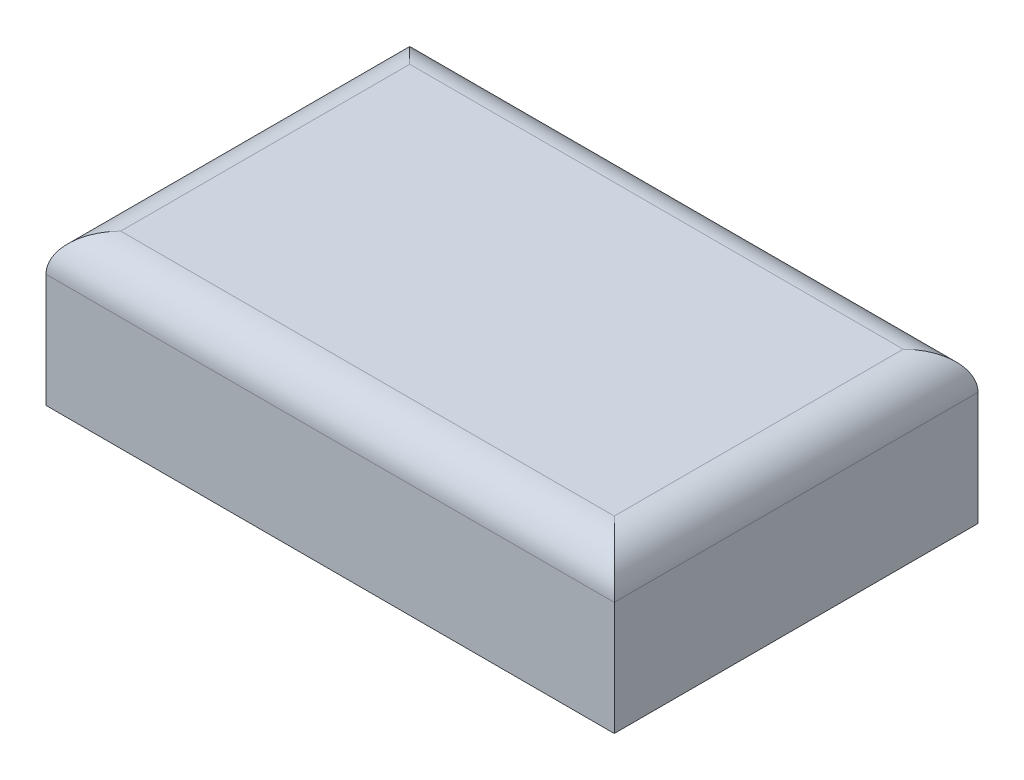
ISO-10303-21;
HEADER;
FILE_DESCRIPTION(('STEP AP214'),'2;1');
FILE_NAME('part.step','',(''),(''),'','','');
FILE_SCHEMA(('AUTOMOTIVE_DESIGN { 1 0 10303 214 1 1 1 1 }'));
ENDSEC;
DATA;
#1=APPLICATION_CONTEXT('core data for automotive mechanical design processes');
#2=APPLICATION_PROTOCOL_DEFINITION('international standard','automotive_design',2000,#1);
#3=PRODUCT_CONTEXT('',#1,'mechanical');
#4=PRODUCT('Part','Part','',(#3));
#5=PRODUCT_RELATED_PRODUCT_CATEGORY('part','',(#4));
#6=PRODUCT_DEFINITION_FORMATION('','',#4);
#7=PRODUCT_DEFINITION_CONTEXT('part definition',#1,'design');
#8=PRODUCT_DEFINITION('design','',#6,#7);
#9=PRODUCT_DEFINITION_SHAPE('','',#8);
#10=(LENGTH_UNIT() NAMED_UNIT(*) SI_UNIT(.MILLI.,.METRE.));
#11=(NAMED_UNIT(*) PLANE_ANGLE_UNIT() SI_UNIT($,.RADIAN.));
#12=(NAMED_UNIT(*) SI_UNIT($,.STERADIAN.) SOLID_ANGLE_UNIT());
#13=UNCERTAINTY_MEASURE_WITH_UNIT(LENGTH_MEASURE(1.E-05),#10,'distance_accuracy_value','');
#14=(GEOMETRIC_REPRESENTATION_CONTEXT(3) GLOBAL_UNCERTAINTY_ASSIGNED_CONTEXT((#13)) GLOBAL_UNIT_ASSIGNED_CONTEXT((#10,
#11,#12)) REPRESENTATION_CONTEXT('',''));
#15=CARTESIAN_POINT('',(0.,0.,0.));
#16=DIRECTION('',(0.,0.,1.));
#17=DIRECTION('',(1.,0.,0.));
#18=AXIS2_PLACEMENT_3D('',#15,#16,#17);
#19=CARTESIAN_POINT('',(-68.2051863267414,20.2,36.4333459335291));
#20=DIRECTION('',(0.,0.,-1.));
#21=DIRECTION('',(-1.,0.,0.));
#22=AXIS2_PLACEMENT_3D('',#19,#20,#21);
#23=PLANE('',#22);
#24=DIRECTION('',(0.,-1.,0.));
#25=VECTOR('',#24,1.);
#26=CARTESIAN_POINT('',(7.83481367325863,20.2,36.4333459335291));
#27=LINE('',#26,#25);
#28=CARTESIAN_POINT('',(7.83481367325863,15.2,36.4333459335291));
#29=VERTEX_POINT('',#28);
#30=CARTESIAN_POINT('',(7.83481367325863,0.,36.4333459335291));
#31=VERTEX_POINT('',#30);
#32=EDGE_CURVE('E97',#29,#31,#27,.T.);
#33=ORIENTED_EDGE('',*,*,#32,.F.);
#34=DIRECTION('',(1.,0.,0.));
#35=VECTOR('',#34,1.);
#36=CARTESIAN_POINT('',(-68.2051863267414,15.2,36.4333459335291));
#37=LINE('',#36,#35);
#38=CARTESIAN_POINT('',(-68.2051863267414,15.2,36.4333459335291));
#39=VERTEX_POINT('',#38);
#40=EDGE_CURVE('E150',#29,#39,#37,.F.);
#41=ORIENTED_EDGE('',*,*,#40,.T.);
#42=DIRECTION('',(0.,-1.,0.));
#43=VECTOR('',#42,1.);
#44=CARTESIAN_POINT('',(-68.2051863267414,20.2,36.4333459335291));
#45=LINE('',#44,#43);
#46=CARTESIAN_POINT('',(-68.2051863267414,0.,36.4333459335291));
#47=VERTEX_POINT('',#46);
#48=EDGE_CURVE('E114',#39,#47,#45,.T.);
#49=ORIENTED_EDGE('',*,*,#48,.T.);
#50=DIRECTION('',(1.,0.,0.));
#51=VECTOR('',#50,1.);
#52=CARTESIAN_POINT('',(-68.2051863267414,0.,36.4333459335291));
#53=LINE('',#52,#51);
#54=EDGE_CURVE('E113',#47,#31,#53,.T.);
#55=ORIENTED_EDGE('',*,*,#54,.T.);
#56=EDGE_LOOP('',(#33,#41,#49,#55));
#57=FACE_BOUND('',#56,.T.);
#58=ADVANCED_FACE('F43',(#57),#23,.F.);
#59=CARTESIAN_POINT('',(7.83481367325861,20.2,-12.2366540664709));
#60=DIRECTION('',(1.,0.,0.));
#61=DIRECTION('',(0.,0.,-1.));
#62=AXIS2_PLACEMENT_3D('',#59,#60,#61);
#63=PLANE('',#62);
#64=DIRECTION('',(0.,-1.,0.));
#65=VECTOR('',#64,1.);
#66=CARTESIAN_POINT('',(7.83481367325861,20.2,-12.2366540664709));
#67=LINE('',#66,#65);
#68=CARTESIAN_POINT('',(7.83481367325861,15.2,-12.2366540664709));
#69=VERTEX_POINT('',#68);
#70=CARTESIAN_POINT('',(7.83481367325861,0.,-12.2366540664709));
#71=VERTEX_POINT('',#70);
#72=EDGE_CURVE('E110',#69,#71,#67,.T.);
#73=ORIENTED_EDGE('',*,*,#72,.F.);
#74=DIRECTION('',(0.,0.,1.));
#75=VECTOR('',#74,1.);
#76=CARTESIAN_POINT('',(7.83481367325863,15.2,36.4333459335291));
#77=LINE('',#76,#75);
#78=EDGE_CURVE('E104',#69,#29,#77,.T.);
#79=ORIENTED_EDGE('',*,*,#78,.T.);
#80=ORIENTED_EDGE('',*,*,#32,.T.);
#81=DIRECTION('',(0.,0.,1.));
#82=VECTOR('',#81,1.);
#83=CARTESIAN_POINT('',(7.83481367325861,0.,-12.2366540664709));
#84=LINE('',#83,#82);
#85=EDGE_CURVE('E101',#71,#31,#84,.T.);
#86=ORIENTED_EDGE('',*,*,#85,.F.);
#87=EDGE_LOOP('',(#73,#79,#80,#86));
#88=FACE_BOUND('',#87,.T.);
#89=ADVANCED_FACE('F99',(#88),#63,.T.);
#90=CARTESIAN_POINT('',(-68.2051863267414,20.2,-12.2366540664709));
#91=DIRECTION('',(0.,0.,-1.));
#92=DIRECTION('',(-1.,0.,0.));
#93=AXIS2_PLACEMENT_3D('',#90,#91,#92);
#94=PLANE('',#93);
#95=DIRECTION('',(0.,-1.,0.));
#96=VECTOR('',#95,1.);
#97=CARTESIAN_POINT('',(-68.2051863267414,20.2,-12.2366540664709));
#98=LINE('',#97,#96);
#99=CARTESIAN_POINT('',(-68.2051863267414,15.2,-12.2366540664709));
#100=VERTEX_POINT('',#99);
#101=CARTESIAN_POINT('',(-68.2051863267414,0.,-12.2366540664709));
#102=VERTEX_POINT('',#101);
#103=EDGE_CURVE('E133',#100,#102,#98,.T.);
#104=ORIENTED_EDGE('',*,*,#103,.F.);
#105=DIRECTION('',(1.,0.,0.));
#106=VECTOR('',#105,1.);
#107=CARTESIAN_POINT('',(7.83481367325861,15.2,-12.2366540664709));
#108=LINE('',#107,#106);
#109=EDGE_CURVE('E53',#100,#69,#108,.T.);
#110=ORIENTED_EDGE('',*,*,#109,.T.);
#111=ORIENTED_EDGE('',*,*,#72,.T.);
#112=DIRECTION('',(1.,0.,0.));
#113=VECTOR('',#112,1.);
#114=CARTESIAN_POINT('',(-68.2051863267414,0.,-12.2366540664709));
#115=LINE('',#114,#113);
#116=EDGE_CURVE('E122',#102,#71,#115,.T.);
#117=ORIENTED_EDGE('',*,*,#116,.F.);
#118=EDGE_LOOP('',(#104,#110,#111,#117));
#119=FACE_BOUND('',#118,.T.);
#120=ADVANCED_FACE('F183',(#119),#94,.T.);
#121=CARTESIAN_POINT('',(-68.2051863267414,20.2,-12.2366540664709));
#122=DIRECTION('',(1.,0.,0.));
#123=DIRECTION('',(0.,0.,-1.));
#124=AXIS2_PLACEMENT_3D('',#121,#122,#123);
#125=PLANE('',#124);
#126=ORIENTED_EDGE('',*,*,#48,.F.);
#127=DIRECTION('',(0.,0.,1.));
#128=VECTOR('',#127,1.);
#129=CARTESIAN_POINT('',(-68.2051863267414,15.2,-12.2366540664709));
#130=LINE('',#129,#128);
#131=EDGE_CURVE('E11',#39,#100,#130,.F.);
#132=ORIENTED_EDGE('',*,*,#131,.T.);
#133=ORIENTED_EDGE('',*,*,#103,.T.);
#134=DIRECTION('',(0.,0.,1.));
#135=VECTOR('',#134,1.);
#136=CARTESIAN_POINT('',(-68.2051863267414,0.,-12.2366540664709));
#137=LINE('',#136,#135);
#138=EDGE_CURVE('E126',#102,#47,#137,.T.);
#139=ORIENTED_EDGE('',*,*,#138,.T.);
#140=EDGE_LOOP('',(#126,#132,#133,#139));
#141=FACE_BOUND('',#140,.T.);
#142=ADVANCED_FACE('F182',(#141),#125,.F.);
#143=CARTESIAN_POINT('',(0.,20.2,0.));
#144=DIRECTION('',(0.,-1.,0.));
#145=DIRECTION('',(0.,0.,-1.));
#146=AXIS2_PLACEMENT_3D('',#143,#144,#145);
#147=PLANE('',#146);
#148=DIRECTION('',(0.,0.,1.));
#149=VECTOR('',#148,1.);
#150=CARTESIAN_POINT('',(-63.2051863267414,20.2,0.));
#151=LINE('',#150,#149);
#152=CARTESIAN_POINT('',(-63.2051863267414,20.2,-7.23665406647088));
#153=VERTEX_POINT('',#152);
#154=CARTESIAN_POINT('',(-63.2051863267414,20.2,31.4333459335291));
#155=VERTEX_POINT('',#154);
#156=EDGE_CURVE('E109',#153,#155,#151,.T.);
#157=ORIENTED_EDGE('',*,*,#156,.T.);
#158=DIRECTION('',(1.,0.,0.));
#159=VECTOR('',#158,1.);
#160=CARTESIAN_POINT('',(0.,20.2,31.4333459335291));
#161=LINE('',#160,#159);
#162=CARTESIAN_POINT('',(2.83481367325862,20.2,31.4333459335291));
#163=VERTEX_POINT('',#162);
#164=EDGE_CURVE('E146',#155,#163,#161,.T.);
#165=ORIENTED_EDGE('',*,*,#164,.T.);
#166=DIRECTION('',(0.,0.,1.));
#167=VECTOR('',#166,1.);
#168=CARTESIAN_POINT('',(2.83481367325861,20.2,-12.2366540664709));
#169=LINE('',#168,#167);
#170=CARTESIAN_POINT('',(2.83481367325861,20.2,-7.23665406647088));
#171=VERTEX_POINT('',#170);
#172=EDGE_CURVE('E143',#163,#171,#169,.F.);
#173=ORIENTED_EDGE('',*,*,#172,.T.);
#174=DIRECTION('',(1.,0.,0.));
#175=VECTOR('',#174,1.);
#176=CARTESIAN_POINT('',(-68.2051863267414,20.2,-7.23665406647088));
#177=LINE('',#176,#175);
#178=EDGE_CURVE('E140',#171,#153,#177,.F.);
#179=ORIENTED_EDGE('',*,*,#178,.T.);
#180=EDGE_LOOP('',(#157,#165,#173,#179));
#181=FACE_BOUND('',#180,.T.);
#182=ADVANCED_FACE('F190',(#181),#147,.F.);
#183=CARTESIAN_POINT('',(0.,0.,0.));
#184=DIRECTION('',(0.,-1.,0.));
#185=DIRECTION('',(0.,0.,-1.));
#186=AXIS2_PLACEMENT_3D('',#183,#184,#185);
#187=PLANE('',#186);
#188=ORIENTED_EDGE('',*,*,#54,.F.);
#189=ORIENTED_EDGE('',*,*,#138,.F.);
#190=ORIENTED_EDGE('',*,*,#116,.T.);
#191=ORIENTED_EDGE('',*,*,#85,.T.);
#192=EDGE_LOOP('',(#188,#189,#190,#191));
#193=FACE_BOUND('',#192,.T.);
#194=ADVANCED_FACE('F120',(#193),#187,.T.);
#195=CARTESIAN_POINT('',(-68.2051863267414,15.2,-7.23665406647088));
#196=DIRECTION('',(-1.,0.,0.));
#197=DIRECTION('',(0.,0.,1.));
#198=AXIS2_PLACEMENT_3D('',#195,#196,#197);
#199=CYLINDRICAL_SURFACE('',#198,5.);
#200=CARTESIAN_POINT('',(2.83481367325861,15.2,-7.23665406647088));
#201=DIRECTION('',(-0.707106781186548,0.,-0.707106781186547));
#202=DIRECTION('',(-0.707106781186547,0.,0.707106781186548));
#203=AXIS2_PLACEMENT_3D('',#200,#201,#202);
#204=ELLIPSE('',#203,7.07106781186547,5.);
#205=EDGE_CURVE('E162',#69,#171,#204,.F.);
#206=ORIENTED_EDGE('',*,*,#205,.F.);
#207=ORIENTED_EDGE('',*,*,#109,.F.);
#208=CARTESIAN_POINT('',(-63.2051863267414,15.2,-7.23665406647088));
#209=DIRECTION('',(-0.707106781186548,0.,0.707106781186547));
#210=DIRECTION('',(0.707106781186547,0.,0.707106781186548));
#211=AXIS2_PLACEMENT_3D('',#208,#209,#210);
#212=ELLIPSE('',#211,7.07106781186547,5.);
#213=EDGE_CURVE('E47',#153,#100,#212,.T.);
#214=ORIENTED_EDGE('',*,*,#213,.F.);
#215=ORIENTED_EDGE('',*,*,#178,.F.);
#216=EDGE_LOOP('',(#206,#207,#214,#215));
#217=FACE_BOUND('',#216,.T.);
#218=ADVANCED_FACE('F45',(#217),#199,.T.);
#219=CARTESIAN_POINT('',(-63.2051863267414,15.2,0.));
#220=DIRECTION('',(0.,0.,1.));
#221=DIRECTION('',(1.,0.,0.));
#222=AXIS2_PLACEMENT_3D('',#219,#220,#221);
#223=CYLINDRICAL_SURFACE('',#222,5.);
#224=ORIENTED_EDGE('',*,*,#213,.T.);
#225=ORIENTED_EDGE('',*,*,#131,.F.);
#226=CARTESIAN_POINT('',(-63.2051863267414,15.2,31.4333459335291));
#227=DIRECTION('',(0.707106781186547,0.,0.707106781186548));
#228=DIRECTION('',(-0.707106781186548,0.,0.707106781186547));
#229=AXIS2_PLACEMENT_3D('',#226,#227,#228);
#230=ELLIPSE('',#229,7.07106781186548,5.);
#231=EDGE_CURVE('E160',#155,#39,#230,.T.);
#232=ORIENTED_EDGE('',*,*,#231,.F.);
#233=ORIENTED_EDGE('',*,*,#156,.F.);
#234=EDGE_LOOP('',(#224,#225,#232,#233));
#235=FACE_BOUND('',#234,.T.);
#236=ADVANCED_FACE('F173',(#235),#223,.T.);
#237=CARTESIAN_POINT('',(2.83481367325861,15.2,-12.2366540664709));
#238=DIRECTION('',(0.,0.,-1.));
#239=DIRECTION('',(-1.,0.,0.));
#240=AXIS2_PLACEMENT_3D('',#237,#238,#239);
#241=CYLINDRICAL_SURFACE('',#240,5.);
#242=ORIENTED_EDGE('',*,*,#205,.T.);
#243=ORIENTED_EDGE('',*,*,#172,.F.);
#244=CARTESIAN_POINT('',(2.83481367325862,15.2,31.4333459335291));
#245=DIRECTION('',(0.707106781186547,0.,-0.707106781186548));
#246=DIRECTION('',(-0.707106781186548,0.,-0.707106781186547));
#247=AXIS2_PLACEMENT_3D('',#244,#245,#246);
#248=ELLIPSE('',#247,7.07106781186548,5.);
#249=EDGE_CURVE('E157',#29,#163,#248,.F.);
#250=ORIENTED_EDGE('',*,*,#249,.F.);
#251=ORIENTED_EDGE('',*,*,#78,.F.);
#252=EDGE_LOOP('',(#242,#243,#250,#251));
#253=FACE_BOUND('',#252,.T.);
#254=ADVANCED_FACE('F178',(#253),#241,.T.);
#255=CARTESIAN_POINT('',(0.,15.2,31.4333459335291));
#256=DIRECTION('',(1.,0.,0.));
#257=DIRECTION('',(0.,0.,-1.));
#258=AXIS2_PLACEMENT_3D('',#255,#256,#257);
#259=CYLINDRICAL_SURFACE('',#258,5.);
#260=ORIENTED_EDGE('',*,*,#231,.T.);
#261=ORIENTED_EDGE('',*,*,#40,.F.);
#262=ORIENTED_EDGE('',*,*,#249,.T.);
#263=ORIENTED_EDGE('',*,*,#164,.F.);
#264=EDGE_LOOP('',(#260,#261,#262,#263));
#265=FACE_BOUND('',#264,.T.);
#266=ADVANCED_FACE('F181',(#265),#259,.T.);
#267=CLOSED_SHELL('',(#58,#89,#120,#142,#182,#194,#218,#236,#254,#266));
#268=MANIFOLD_SOLID_BREP('B2',#267);
#269=ADVANCED_BREP_SHAPE_REPRESENTATION('',(#18,#268),#14);
#270=SHAPE_DEFINITION_REPRESENTATION(#9,#269);
ENDSEC;
END-ISO-10303-21;
